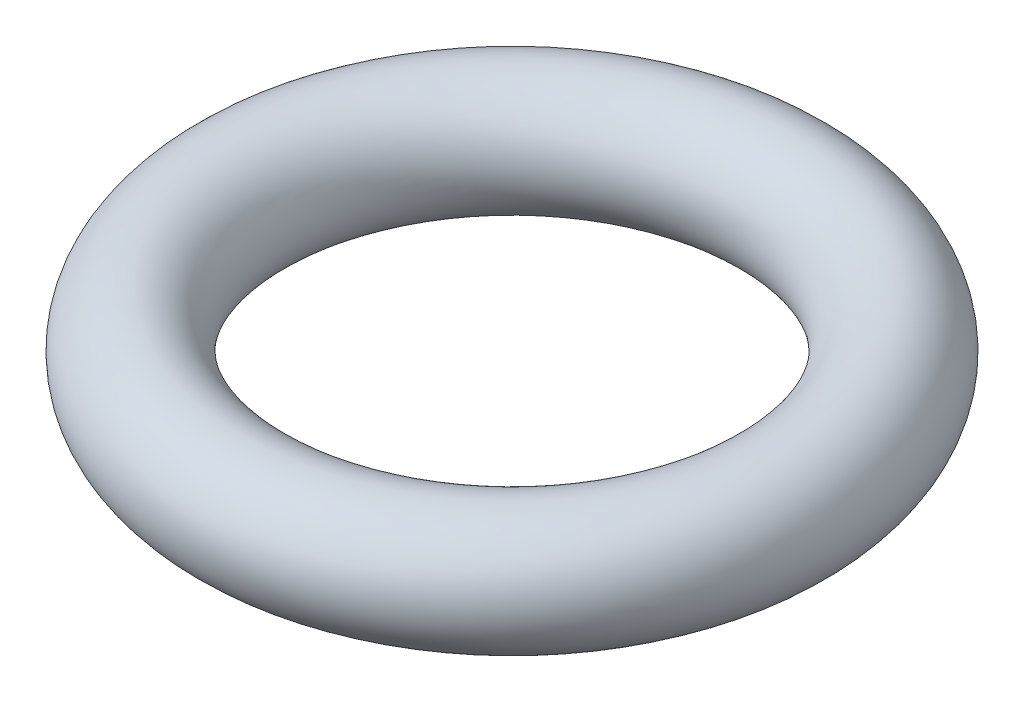
ISO-10303-21;
HEADER;
FILE_DESCRIPTION(('STEP AP214'),'2;1');
FILE_NAME('part.step','',(''),(''),'','','');
FILE_SCHEMA(('AUTOMOTIVE_DESIGN { 1 0 10303 214 1 1 1 1 }'));
ENDSEC;
DATA;
#1=APPLICATION_CONTEXT('core data for automotive mechanical design processes');
#2=APPLICATION_PROTOCOL_DEFINITION('international standard','automotive_design',2000,#1);
#3=PRODUCT_CONTEXT('',#1,'mechanical');
#4=PRODUCT('Part','Part','',(#3));
#5=PRODUCT_RELATED_PRODUCT_CATEGORY('part','',(#4));
#6=PRODUCT_DEFINITION_FORMATION('','',#4);
#7=PRODUCT_DEFINITION_CONTEXT('part definition',#1,'design');
#8=PRODUCT_DEFINITION('design','',#6,#7);
#9=PRODUCT_DEFINITION_SHAPE('','',#8);
#10=(LENGTH_UNIT() NAMED_UNIT(*) SI_UNIT(.MILLI.,.METRE.));
#11=(NAMED_UNIT(*) PLANE_ANGLE_UNIT() SI_UNIT($,.RADIAN.));
#12=(NAMED_UNIT(*) SI_UNIT($,.STERADIAN.) SOLID_ANGLE_UNIT());
#13=UNCERTAINTY_MEASURE_WITH_UNIT(LENGTH_MEASURE(1.E-05),#10,'distance_accuracy_value','');
#14=(GEOMETRIC_REPRESENTATION_CONTEXT(3) GLOBAL_UNCERTAINTY_ASSIGNED_CONTEXT((#13)) GLOBAL_UNIT_ASSIGNED_CONTEXT((#10,
#11,#12)) REPRESENTATION_CONTEXT('',''));
#15=CARTESIAN_POINT('',(0.,0.,0.));
#16=DIRECTION('',(0.,0.,1.));
#17=DIRECTION('',(1.,0.,0.));
#18=AXIS2_PLACEMENT_3D('',#15,#16,#17);
#19=CARTESIAN_POINT('',(0.,0.,0.));
#20=DIRECTION('',(0.,-1.,0.));
#21=DIRECTION('',(0.,0.,-1.));
#22=AXIS2_PLACEMENT_3D('',#19,#20,#21);
#23=TOROIDAL_SURFACE('',#22,5.9055,1.3081);
#24=CARTESIAN_POINT('',(0.,0.,-7.2136));
#25=VERTEX_POINT('',#24);
#26=VERTEX_LOOP('',#25);
#27=FACE_BOUND('',#26,.T.);
#28=ADVANCED_FACE('F26',(#27),#23,.T.);
#29=CLOSED_SHELL('',(#28));
#30=MANIFOLD_SOLID_BREP('B2',#29);
#31=ADVANCED_BREP_SHAPE_REPRESENTATION('',(#18,#30),#14);
#32=SHAPE_DEFINITION_REPRESENTATION(#9,#31);
ENDSEC;
END-ISO-10303-21;
